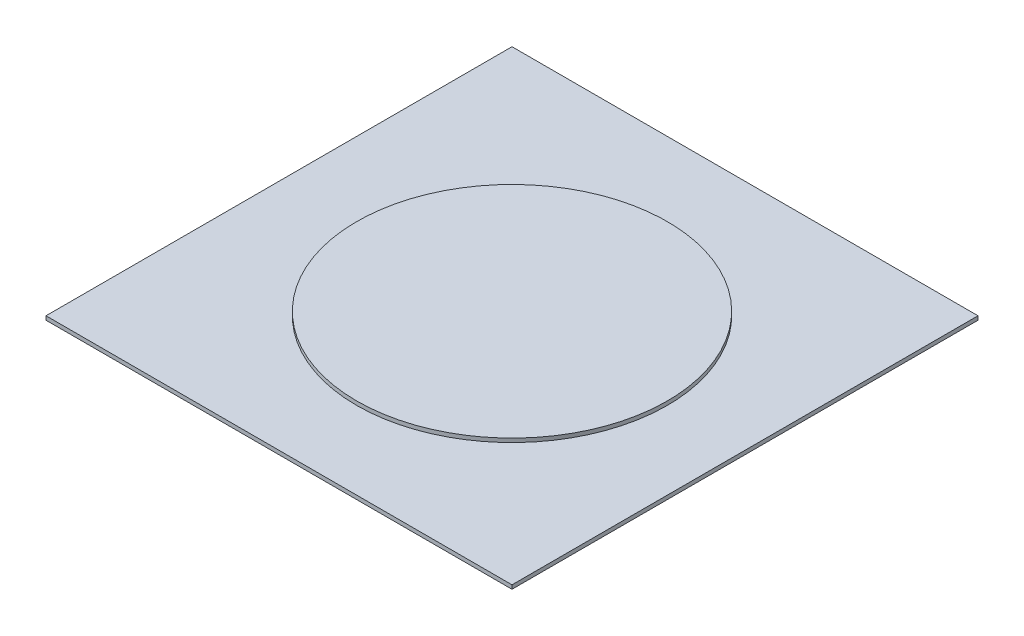
ISO-10303-21;
HEADER;
FILE_DESCRIPTION(('STEP AP214'),'2;1');
FILE_NAME('part.step','',(''),(''),'','','');
FILE_SCHEMA(('AUTOMOTIVE_DESIGN { 1 0 10303 214 1 1 1 1 }'));
ENDSEC;
DATA;
#1=APPLICATION_CONTEXT('core data for automotive mechanical design processes');
#2=APPLICATION_PROTOCOL_DEFINITION('international standard','automotive_design',2000,#1);
#3=PRODUCT_CONTEXT('',#1,'mechanical');
#4=PRODUCT('Part','Part','',(#3));
#5=PRODUCT_RELATED_PRODUCT_CATEGORY('part','',(#4));
#6=PRODUCT_DEFINITION_FORMATION('','',#4);
#7=PRODUCT_DEFINITION_CONTEXT('part definition',#1,'design');
#8=PRODUCT_DEFINITION('design','',#6,#7);
#9=PRODUCT_DEFINITION_SHAPE('','',#8);
#10=(LENGTH_UNIT() NAMED_UNIT(*) SI_UNIT(.MILLI.,.METRE.));
#11=(NAMED_UNIT(*) PLANE_ANGLE_UNIT() SI_UNIT($,.RADIAN.));
#12=(NAMED_UNIT(*) SI_UNIT($,.STERADIAN.) SOLID_ANGLE_UNIT());
#13=UNCERTAINTY_MEASURE_WITH_UNIT(LENGTH_MEASURE(1.E-05),#10,'distance_accuracy_value','');
#14=(GEOMETRIC_REPRESENTATION_CONTEXT(3) GLOBAL_UNCERTAINTY_ASSIGNED_CONTEXT((#13)) GLOBAL_UNIT_ASSIGNED_CONTEXT((#10,
#11,#12)) REPRESENTATION_CONTEXT('',''));
#15=CARTESIAN_POINT('',(0.,0.,0.));
#16=DIRECTION('',(0.,0.,1.));
#17=DIRECTION('',(1.,0.,0.));
#18=AXIS2_PLACEMENT_3D('',#15,#16,#17);
#19=CARTESIAN_POINT('',(60.,1.,-60.));
#20=DIRECTION('',(-1.,0.,0.));
#21=DIRECTION('',(0.,0.,1.));
#22=AXIS2_PLACEMENT_3D('',#19,#20,#21);
#23=PLANE('',#22);
#24=DIRECTION('',(0.,0.,-1.));
#25=VECTOR('',#24,1.);
#26=CARTESIAN_POINT('',(60.,0.,-60.));
#27=LINE('',#26,#25);
#28=CARTESIAN_POINT('',(60.,0.,60.));
#29=VERTEX_POINT('',#28);
#30=CARTESIAN_POINT('',(60.,0.,-60.));
#31=VERTEX_POINT('',#30);
#32=EDGE_CURVE('E102',#29,#31,#27,.T.);
#33=ORIENTED_EDGE('',*,*,#32,.T.);
#34=DIRECTION('',(0.,-1.,0.));
#35=VECTOR('',#34,1.);
#36=CARTESIAN_POINT('',(60.,1.,-60.));
#37=LINE('',#36,#35);
#38=CARTESIAN_POINT('',(60.,1.,-60.));
#39=VERTEX_POINT('',#38);
#40=EDGE_CURVE('E39',#39,#31,#37,.T.);
#41=ORIENTED_EDGE('',*,*,#40,.F.);
#42=DIRECTION('',(0.,0.,-1.));
#43=VECTOR('',#42,1.);
#44=CARTESIAN_POINT('',(60.,1.,-60.));
#45=LINE('',#44,#43);
#46=CARTESIAN_POINT('',(60.,1.,60.));
#47=VERTEX_POINT('',#46);
#48=EDGE_CURVE('E89',#47,#39,#45,.T.);
#49=ORIENTED_EDGE('',*,*,#48,.F.);
#50=DIRECTION('',(0.,-1.,0.));
#51=VECTOR('',#50,1.);
#52=CARTESIAN_POINT('',(60.,1.,60.));
#53=LINE('',#52,#51);
#54=EDGE_CURVE('E98',#47,#29,#53,.T.);
#55=ORIENTED_EDGE('',*,*,#54,.T.);
#56=EDGE_LOOP('',(#33,#41,#49,#55));
#57=FACE_BOUND('',#56,.T.);
#58=ADVANCED_FACE('F36',(#57),#23,.F.);
#59=CARTESIAN_POINT('',(-60.,1.,-60.));
#60=DIRECTION('',(0.,0.,1.));
#61=DIRECTION('',(1.,0.,0.));
#62=AXIS2_PLACEMENT_3D('',#59,#60,#61);
#63=PLANE('',#62);
#64=DIRECTION('',(-1.,0.,0.));
#65=VECTOR('',#64,1.);
#66=CARTESIAN_POINT('',(-60.,0.,-60.));
#67=LINE('',#66,#65);
#68=CARTESIAN_POINT('',(-60.,0.,-60.));
#69=VERTEX_POINT('',#68);
#70=EDGE_CURVE('E94',#31,#69,#67,.T.);
#71=ORIENTED_EDGE('',*,*,#70,.T.);
#72=DIRECTION('',(0.,-1.,0.));
#73=VECTOR('',#72,1.);
#74=CARTESIAN_POINT('',(-60.,1.,-60.));
#75=LINE('',#74,#73);
#76=CARTESIAN_POINT('',(-60.,1.,-60.));
#77=VERTEX_POINT('',#76);
#78=EDGE_CURVE('E92',#77,#69,#75,.T.);
#79=ORIENTED_EDGE('',*,*,#78,.F.);
#80=DIRECTION('',(-1.,0.,0.));
#81=VECTOR('',#80,1.);
#82=CARTESIAN_POINT('',(-60.,1.,-60.));
#83=LINE('',#82,#81);
#84=EDGE_CURVE('E84',#39,#77,#83,.T.);
#85=ORIENTED_EDGE('',*,*,#84,.F.);
#86=ORIENTED_EDGE('',*,*,#40,.T.);
#87=EDGE_LOOP('',(#71,#79,#85,#86));
#88=FACE_BOUND('',#87,.T.);
#89=ADVANCED_FACE('F93',(#88),#63,.F.);
#90=CARTESIAN_POINT('',(-60.,1.,-60.));
#91=DIRECTION('',(1.,0.,0.));
#92=DIRECTION('',(0.,0.,-1.));
#93=AXIS2_PLACEMENT_3D('',#90,#91,#92);
#94=PLANE('',#93);
#95=DIRECTION('',(0.,0.,1.));
#96=VECTOR('',#95,1.);
#97=CARTESIAN_POINT('',(-60.,0.,-60.));
#98=LINE('',#97,#96);
#99=CARTESIAN_POINT('',(-60.,0.,60.));
#100=VERTEX_POINT('',#99);
#101=EDGE_CURVE('E70',#69,#100,#98,.T.);
#102=ORIENTED_EDGE('',*,*,#101,.T.);
#103=DIRECTION('',(0.,-1.,0.));
#104=VECTOR('',#103,1.);
#105=CARTESIAN_POINT('',(-60.,1.,60.));
#106=LINE('',#105,#104);
#107=CARTESIAN_POINT('',(-60.,1.,60.));
#108=VERTEX_POINT('',#107);
#109=EDGE_CURVE('E95',#108,#100,#106,.T.);
#110=ORIENTED_EDGE('',*,*,#109,.F.);
#111=DIRECTION('',(0.,0.,1.));
#112=VECTOR('',#111,1.);
#113=CARTESIAN_POINT('',(-60.,1.,-60.));
#114=LINE('',#113,#112);
#115=EDGE_CURVE('E87',#77,#108,#114,.T.);
#116=ORIENTED_EDGE('',*,*,#115,.F.);
#117=ORIENTED_EDGE('',*,*,#78,.T.);
#118=EDGE_LOOP('',(#102,#110,#116,#117));
#119=FACE_BOUND('',#118,.T.);
#120=ADVANCED_FACE('F96',(#119),#94,.F.);
#121=CARTESIAN_POINT('',(-60.,1.,60.));
#122=DIRECTION('',(0.,0.,-1.));
#123=DIRECTION('',(-1.,0.,0.));
#124=AXIS2_PLACEMENT_3D('',#121,#122,#123);
#125=PLANE('',#124);
#126=DIRECTION('',(1.,0.,0.));
#127=VECTOR('',#126,1.);
#128=CARTESIAN_POINT('',(-60.,0.,60.));
#129=LINE('',#128,#127);
#130=EDGE_CURVE('E76',#100,#29,#129,.T.);
#131=ORIENTED_EDGE('',*,*,#130,.T.);
#132=ORIENTED_EDGE('',*,*,#54,.F.);
#133=DIRECTION('',(1.,0.,0.));
#134=VECTOR('',#133,1.);
#135=CARTESIAN_POINT('',(-60.,1.,60.));
#136=LINE('',#135,#134);
#137=EDGE_CURVE('E53',#108,#47,#136,.T.);
#138=ORIENTED_EDGE('',*,*,#137,.F.);
#139=ORIENTED_EDGE('',*,*,#109,.T.);
#140=EDGE_LOOP('',(#131,#132,#138,#139));
#141=FACE_BOUND('',#140,.T.);
#142=ADVANCED_FACE('F110',(#141),#125,.F.);
#143=CARTESIAN_POINT('',(0.,1.,0.));
#144=DIRECTION('',(0.,1.,0.));
#145=DIRECTION('',(0.,0.,1.));
#146=AXIS2_PLACEMENT_3D('',#143,#144,#145);
#147=PLANE('',#146);
#148=CARTESIAN_POINT('',(0.,1.,0.));
#149=DIRECTION('',(0.,1.,0.));
#150=DIRECTION('',(0.,0.,1.));
#151=AXIS2_PLACEMENT_3D('',#148,#149,#150);
#152=CIRCLE('',#151,40.);
#153=CARTESIAN_POINT('',(0.,1.,40.));
#154=VERTEX_POINT('',#153);
#155=EDGE_CURVE('E11',#154,#154,#152,.T.);
#156=ORIENTED_EDGE('',*,*,#155,.F.);
#157=EDGE_LOOP('',(#156));
#158=FACE_BOUND('',#157,.T.);
#159=ORIENTED_EDGE('',*,*,#48,.T.);
#160=ORIENTED_EDGE('',*,*,#84,.T.);
#161=ORIENTED_EDGE('',*,*,#115,.T.);
#162=ORIENTED_EDGE('',*,*,#137,.T.);
#163=EDGE_LOOP('',(#159,#160,#161,#162));
#164=FACE_BOUND('',#163,.T.);
#165=ADVANCED_FACE('F85',(#158,#164),#147,.T.);
#166=CARTESIAN_POINT('',(0.,0.,0.));
#167=DIRECTION('',(0.,1.,0.));
#168=DIRECTION('',(0.,0.,1.));
#169=AXIS2_PLACEMENT_3D('',#166,#167,#168);
#170=PLANE('',#169);
#171=ORIENTED_EDGE('',*,*,#32,.F.);
#172=ORIENTED_EDGE('',*,*,#130,.F.);
#173=ORIENTED_EDGE('',*,*,#101,.F.);
#174=ORIENTED_EDGE('',*,*,#70,.F.);
#175=EDGE_LOOP('',(#171,#172,#173,#174));
#176=FACE_BOUND('',#175,.T.);
#177=ADVANCED_FACE('F113',(#176),#170,.F.);
#178=CARTESIAN_POINT('',(0.,2.,0.));
#179=DIRECTION('',(0.,-1.,0.));
#180=DIRECTION('',(0.,0.,-1.));
#181=AXIS2_PLACEMENT_3D('',#178,#179,#180);
#182=CYLINDRICAL_SURFACE('',#181,40.);
#183=CARTESIAN_POINT('',(0.,2.,0.));
#184=DIRECTION('',(0.,1.,0.));
#185=DIRECTION('',(0.,0.,1.));
#186=AXIS2_PLACEMENT_3D('',#183,#184,#185);
#187=CIRCLE('',#186,40.);
#188=CARTESIAN_POINT('',(0.,2.,40.));
#189=VERTEX_POINT('',#188);
#190=EDGE_CURVE('E105',#189,#189,#187,.T.);
#191=ORIENTED_EDGE('',*,*,#190,.F.);
#192=EDGE_LOOP('',(#191));
#193=FACE_BOUND('',#192,.T.);
#194=ORIENTED_EDGE('',*,*,#155,.T.);
#195=EDGE_LOOP('',(#194));
#196=FACE_BOUND('',#195,.T.);
#197=ADVANCED_FACE('F121',(#193,#196),#182,.T.);
#198=CARTESIAN_POINT('',(0.,2.,0.));
#199=DIRECTION('',(0.,1.,0.));
#200=DIRECTION('',(0.,0.,1.));
#201=AXIS2_PLACEMENT_3D('',#198,#199,#200);
#202=PLANE('',#201);
#203=ORIENTED_EDGE('',*,*,#190,.T.);
#204=EDGE_LOOP('',(#203));
#205=FACE_BOUND('',#204,.T.);
#206=ADVANCED_FACE('F119',(#205),#202,.T.);
#207=CLOSED_SHELL('',(#58,#89,#120,#142,#165,#177,#197,#206));
#208=MANIFOLD_SOLID_BREP('B2',#207);
#209=ADVANCED_BREP_SHAPE_REPRESENTATION('',(#18,#208),#14);
#210=SHAPE_DEFINITION_REPRESENTATION(#9,#209);
ENDSEC;
END-ISO-10303-21;
